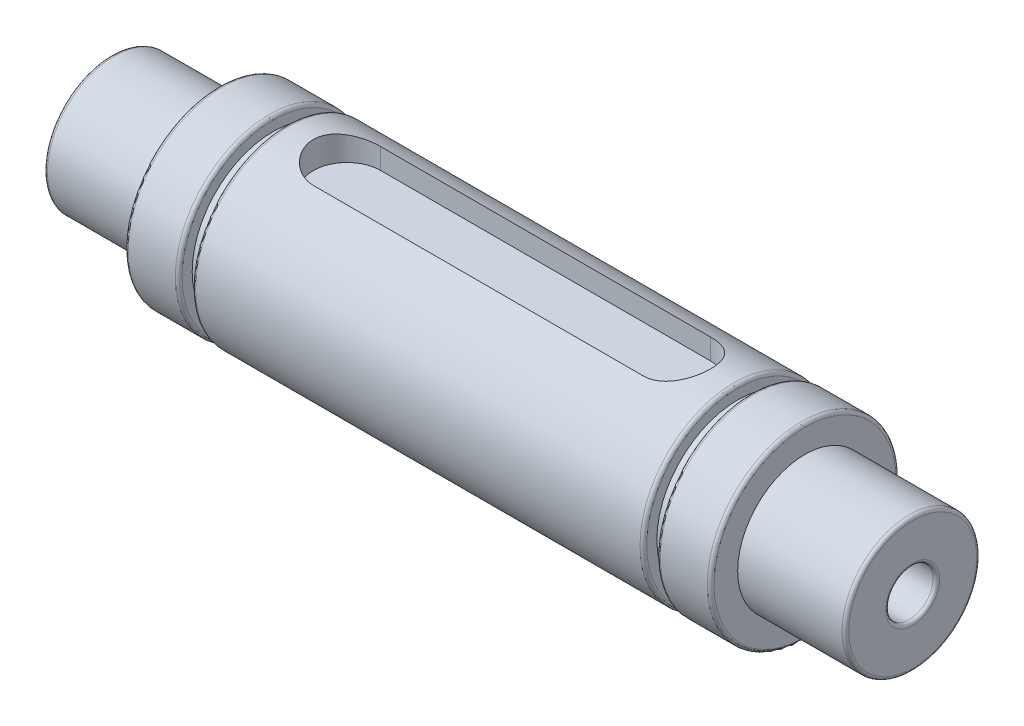
ISO-10303-21;
HEADER;
FILE_DESCRIPTION(('STEP AP214'),'2;1');
FILE_NAME('part.step','',(''),(''),'','','');
FILE_SCHEMA(('AUTOMOTIVE_DESIGN { 1 0 10303 214 1 1 1 1 }'));
ENDSEC;
DATA;
#1=APPLICATION_CONTEXT('core data for automotive mechanical design processes');
#2=APPLICATION_PROTOCOL_DEFINITION('international standard','automotive_design',2000,#1);
#3=PRODUCT_CONTEXT('',#1,'mechanical');
#4=PRODUCT('Part','Part','',(#3));
#5=PRODUCT_RELATED_PRODUCT_CATEGORY('part','',(#4));
#6=PRODUCT_DEFINITION_FORMATION('','',#4);
#7=PRODUCT_DEFINITION_CONTEXT('part definition',#1,'design');
#8=PRODUCT_DEFINITION('design','',#6,#7);
#9=PRODUCT_DEFINITION_SHAPE('','',#8);
#10=(LENGTH_UNIT() NAMED_UNIT(*) SI_UNIT(.MILLI.,.METRE.));
#11=(NAMED_UNIT(*) PLANE_ANGLE_UNIT() SI_UNIT($,.RADIAN.));
#12=(NAMED_UNIT(*) SI_UNIT($,.STERADIAN.) SOLID_ANGLE_UNIT());
#13=UNCERTAINTY_MEASURE_WITH_UNIT(LENGTH_MEASURE(1.E-05),#10,'distance_accuracy_value','');
#14=(GEOMETRIC_REPRESENTATION_CONTEXT(3) GLOBAL_UNCERTAINTY_ASSIGNED_CONTEXT((#13)) GLOBAL_UNIT_ASSIGNED_CONTEXT((#10,
#11,#12)) REPRESENTATION_CONTEXT('',''));
#15=CARTESIAN_POINT('',(0.,0.,0.));
#16=DIRECTION('',(0.,0.,1.));
#17=DIRECTION('',(1.,0.,0.));
#18=AXIS2_PLACEMENT_3D('',#15,#16,#17);
#19=CARTESIAN_POINT('',(-23.25,0.,-1.75));
#20=DIRECTION('',(1.,0.,0.));
#21=DIRECTION('',(0.,0.,-1.));
#22=AXIS2_PLACEMENT_3D('',#19,#20,#21);
#23=PLANE('',#22);
#24=CARTESIAN_POINT('',(-23.25,0.,0.));
#25=DIRECTION('',(1.,0.,0.));
#26=DIRECTION('',(0.,0.,-1.));
#27=AXIS2_PLACEMENT_3D('',#24,#25,#26);
#28=CIRCLE('',#27,0.25);
#29=CARTESIAN_POINT('',(-23.25,0.,-0.25));
#30=VERTEX_POINT('',#29);
#31=EDGE_CURVE('E181',#30,#30,#28,.F.);
#32=ORIENTED_EDGE('',*,*,#31,.T.);
#33=EDGE_LOOP('',(#32));
#34=FACE_BOUND('',#33,.T.);
#35=ADVANCED_FACE('F33',(#34),#23,.F.);
#36=CARTESIAN_POINT('',(23.25,0.,-1.75000000000001));
#37=DIRECTION('',(-1.,0.,0.));
#38=DIRECTION('',(0.,0.,1.));
#39=AXIS2_PLACEMENT_3D('',#36,#37,#38);
#40=PLANE('',#39);
#41=CARTESIAN_POINT('',(23.25,0.,0.));
#42=DIRECTION('',(-1.,0.,0.));
#43=DIRECTION('',(0.,0.,1.));
#44=AXIS2_PLACEMENT_3D('',#41,#42,#43);
#45=CIRCLE('',#44,0.250000000000008);
#46=CARTESIAN_POINT('',(23.25,0.,0.250000000000008));
#47=VERTEX_POINT('',#46);
#48=EDGE_CURVE('E190',#47,#47,#45,.F.);
#49=ORIENTED_EDGE('',*,*,#48,.T.);
#50=EDGE_LOOP('',(#49));
#51=FACE_BOUND('',#50,.T.);
#52=ADVANCED_FACE('F256',(#51),#40,.F.);
#53=CARTESIAN_POINT('',(-23.6016990362538,0.,0.));
#54=DIRECTION('',(-1.,0.,0.));
#55=DIRECTION('',(0.,0.,1.));
#56=AXIS2_PLACEMENT_3D('',#53,#54,#55);
#57=CYLINDRICAL_SURFACE('',#56,1.75000000000001);
#58=CARTESIAN_POINT('',(24.75,0.,0.));
#59=DIRECTION('',(-1.,0.,0.));
#60=DIRECTION('',(0.,0.,1.));
#61=AXIS2_PLACEMENT_3D('',#58,#59,#60);
#62=CIRCLE('',#61,1.75000000000001);
#63=CARTESIAN_POINT('',(24.75,0.,1.75000000000001));
#64=VERTEX_POINT('',#63);
#65=EDGE_CURVE('E187',#64,#64,#62,.T.);
#66=ORIENTED_EDGE('',*,*,#65,.T.);
#67=EDGE_LOOP('',(#66));
#68=FACE_BOUND('',#67,.T.);
#69=CARTESIAN_POINT('',(29.5,0.,0.));
#70=DIRECTION('',(-1.,0.,0.));
#71=DIRECTION('',(0.,0.,1.));
#72=AXIS2_PLACEMENT_3D('',#69,#70,#71);
#73=CIRCLE('',#72,1.75000000000001);
#74=CARTESIAN_POINT('',(29.5,0.,1.75000000000001));
#75=VERTEX_POINT('',#74);
#76=EDGE_CURVE('E127',#75,#75,#73,.F.);
#77=ORIENTED_EDGE('',*,*,#76,.T.);
#78=EDGE_LOOP('',(#77));
#79=FACE_BOUND('',#78,.T.);
#80=ADVANCED_FACE('F262',(#68,#79),#57,.F.);
#81=CARTESIAN_POINT('',(29.75,0.,-5.));
#82=DIRECTION('',(-1.,0.,0.));
#83=DIRECTION('',(0.,0.,1.));
#84=AXIS2_PLACEMENT_3D('',#81,#82,#83);
#85=PLANE('',#84);
#86=CARTESIAN_POINT('',(29.75,0.,0.));
#87=DIRECTION('',(-1.,0.,0.));
#88=DIRECTION('',(0.,0.,1.));
#89=AXIS2_PLACEMENT_3D('',#86,#87,#88);
#90=CIRCLE('',#89,2.00000000000001);
#91=CARTESIAN_POINT('',(29.75,0.,2.00000000000001));
#92=VERTEX_POINT('',#91);
#93=EDGE_CURVE('E124',#92,#92,#90,.T.);
#94=ORIENTED_EDGE('',*,*,#93,.T.);
#95=EDGE_LOOP('',(#94));
#96=FACE_BOUND('',#95,.T.);
#97=CARTESIAN_POINT('',(29.75,0.,0.));
#98=DIRECTION('',(-1.,0.,0.));
#99=DIRECTION('',(0.,0.,1.));
#100=AXIS2_PLACEMENT_3D('',#97,#98,#99);
#101=CIRCLE('',#100,4.75);
#102=CARTESIAN_POINT('',(29.75,0.,4.75));
#103=VERTEX_POINT('',#102);
#104=EDGE_CURVE('E121',#103,#103,#101,.F.);
#105=ORIENTED_EDGE('',*,*,#104,.T.);
#106=EDGE_LOOP('',(#105));
#107=FACE_BOUND('',#106,.T.);
#108=ADVANCED_FACE('F326',(#96,#107),#85,.F.);
#109=CARTESIAN_POINT('',(-23.6016990362538,0.,0.));
#110=DIRECTION('',(-1.,0.,0.));
#111=DIRECTION('',(0.,0.,1.));
#112=AXIS2_PLACEMENT_3D('',#109,#110,#111);
#113=CYLINDRICAL_SURFACE('',#112,5.);
#114=CARTESIAN_POINT('',(29.5,0.,0.));
#115=DIRECTION('',(-1.,0.,0.));
#116=DIRECTION('',(0.,0.,1.));
#117=AXIS2_PLACEMENT_3D('',#114,#115,#116);
#118=CIRCLE('',#117,5.);
#119=CARTESIAN_POINT('',(29.5,0.,5.));
#120=VERTEX_POINT('',#119);
#121=EDGE_CURVE('E178',#120,#120,#118,.T.);
#122=ORIENTED_EDGE('',*,*,#121,.T.);
#123=EDGE_LOOP('',(#122));
#124=FACE_BOUND('',#123,.T.);
#125=CARTESIAN_POINT('',(21.75,0.,0.));
#126=DIRECTION('',(-1.,0.,0.));
#127=DIRECTION('',(0.,0.,1.));
#128=AXIS2_PLACEMENT_3D('',#125,#126,#127);
#129=CIRCLE('',#128,5.);
#130=CARTESIAN_POINT('',(21.75,0.,5.));
#131=VERTEX_POINT('',#130);
#132=EDGE_CURVE('E118',#131,#131,#129,.T.);
#133=ORIENTED_EDGE('',*,*,#132,.F.);
#134=EDGE_LOOP('',(#133));
#135=FACE_BOUND('',#134,.T.);
#136=ADVANCED_FACE('F333',(#124,#135),#113,.T.);
#137=CARTESIAN_POINT('',(21.75,0.,-7.));
#138=DIRECTION('',(-1.,0.,0.));
#139=DIRECTION('',(0.,0.,1.));
#140=AXIS2_PLACEMENT_3D('',#137,#138,#139);
#141=PLANE('',#140);
#142=CARTESIAN_POINT('',(21.75,0.,0.));
#143=DIRECTION('',(-1.,0.,0.));
#144=DIRECTION('',(0.,0.,1.));
#145=AXIS2_PLACEMENT_3D('',#142,#143,#144);
#146=CIRCLE('',#145,6.75);
#147=CARTESIAN_POINT('',(21.75,0.,6.75));
#148=VERTEX_POINT('',#147);
#149=EDGE_CURVE('E175',#148,#148,#146,.F.);
#150=ORIENTED_EDGE('',*,*,#149,.T.);
#151=EDGE_LOOP('',(#150));
#152=FACE_BOUND('',#151,.T.);
#153=ORIENTED_EDGE('',*,*,#132,.T.);
#154=EDGE_LOOP('',(#153));
#155=FACE_BOUND('',#154,.T.);
#156=ADVANCED_FACE('F341',(#152,#155),#141,.F.);
#157=CARTESIAN_POINT('',(-23.6016990362538,0.,0.));
#158=DIRECTION('',(-1.,0.,0.));
#159=DIRECTION('',(0.,0.,1.));
#160=AXIS2_PLACEMENT_3D('',#157,#158,#159);
#161=CYLINDRICAL_SURFACE('',#160,7.);
#162=CARTESIAN_POINT('',(18.,0.,0.));
#163=DIRECTION('',(1.,0.,0.));
#164=DIRECTION('',(0.,0.,-1.));
#165=AXIS2_PLACEMENT_3D('',#162,#163,#164);
#166=CIRCLE('',#165,7.);
#167=CARTESIAN_POINT('',(18.,0.,-7.));
#168=VERTEX_POINT('',#167);
#169=EDGE_CURVE('E169',#168,#168,#166,.T.);
#170=ORIENTED_EDGE('',*,*,#169,.T.);
#171=EDGE_LOOP('',(#170));
#172=FACE_BOUND('',#171,.T.);
#173=CARTESIAN_POINT('',(21.5,0.,0.));
#174=DIRECTION('',(-1.,0.,0.));
#175=DIRECTION('',(0.,0.,1.));
#176=AXIS2_PLACEMENT_3D('',#173,#174,#175);
#177=CIRCLE('',#176,7.);
#178=CARTESIAN_POINT('',(21.5,0.,7.));
#179=VERTEX_POINT('',#178);
#180=EDGE_CURVE('E166',#179,#179,#177,.T.);
#181=ORIENTED_EDGE('',*,*,#180,.T.);
#182=EDGE_LOOP('',(#181));
#183=FACE_BOUND('',#182,.T.);
#184=ADVANCED_FACE('F346',(#172,#183),#161,.T.);
#185=CARTESIAN_POINT('',(17.75,0.,-6.00000000000001));
#186=DIRECTION('',(1.,0.,0.));
#187=DIRECTION('',(0.,0.,-1.));
#188=AXIS2_PLACEMENT_3D('',#185,#186,#187);
#189=PLANE('',#188);
#190=CARTESIAN_POINT('',(17.75,0.,0.));
#191=DIRECTION('',(1.,0.,0.));
#192=DIRECTION('',(0.,0.,-1.));
#193=AXIS2_PLACEMENT_3D('',#190,#191,#192);
#194=CIRCLE('',#193,6.75);
#195=CARTESIAN_POINT('',(17.75,0.,-6.75));
#196=VERTEX_POINT('',#195);
#197=EDGE_CURVE('E163',#196,#196,#194,.F.);
#198=ORIENTED_EDGE('',*,*,#197,.T.);
#199=EDGE_LOOP('',(#198));
#200=FACE_BOUND('',#199,.T.);
#201=CARTESIAN_POINT('',(17.75,0.,0.));
#202=DIRECTION('',(-1.,0.,0.));
#203=DIRECTION('',(0.,0.,1.));
#204=AXIS2_PLACEMENT_3D('',#201,#202,#203);
#205=CIRCLE('',#204,6.00000000000001);
#206=CARTESIAN_POINT('',(17.75,0.,6.00000000000001));
#207=VERTEX_POINT('',#206);
#208=EDGE_CURVE('E115',#207,#207,#205,.T.);
#209=ORIENTED_EDGE('',*,*,#208,.F.);
#210=EDGE_LOOP('',(#209));
#211=FACE_BOUND('',#210,.T.);
#212=ADVANCED_FACE('F352',(#200,#211),#189,.F.);
#213=CARTESIAN_POINT('',(-23.6016990362538,0.,0.));
#214=DIRECTION('',(-1.,0.,0.));
#215=DIRECTION('',(0.,0.,1.));
#216=AXIS2_PLACEMENT_3D('',#213,#214,#215);
#217=CYLINDRICAL_SURFACE('',#216,6.00000000000001);
#218=CARTESIAN_POINT('',(16.75,0.,0.));
#219=DIRECTION('',(-1.,0.,0.));
#220=DIRECTION('',(0.,0.,1.));
#221=AXIS2_PLACEMENT_3D('',#218,#219,#220);
#222=CIRCLE('',#221,6.);
#223=CARTESIAN_POINT('',(16.75,0.,6.));
#224=VERTEX_POINT('',#223);
#225=EDGE_CURVE('E112',#224,#224,#222,.T.);
#226=ORIENTED_EDGE('',*,*,#225,.F.);
#227=EDGE_LOOP('',(#226));
#228=FACE_BOUND('',#227,.T.);
#229=ORIENTED_EDGE('',*,*,#208,.T.);
#230=EDGE_LOOP('',(#229));
#231=FACE_BOUND('',#230,.T.);
#232=ADVANCED_FACE('F358',(#228,#231),#217,.T.);
#233=CARTESIAN_POINT('',(16.75,0.,-7.));
#234=DIRECTION('',(-1.,0.,0.));
#235=DIRECTION('',(0.,0.,1.));
#236=AXIS2_PLACEMENT_3D('',#233,#234,#235);
#237=PLANE('',#236);
#238=CARTESIAN_POINT('',(16.75,0.,0.));
#239=DIRECTION('',(-1.,0.,0.));
#240=DIRECTION('',(0.,0.,1.));
#241=AXIS2_PLACEMENT_3D('',#238,#239,#240);
#242=CIRCLE('',#241,6.75);
#243=CARTESIAN_POINT('',(16.75,0.,6.75));
#244=VERTEX_POINT('',#243);
#245=EDGE_CURVE('E172',#244,#244,#242,.F.);
#246=ORIENTED_EDGE('',*,*,#245,.T.);
#247=EDGE_LOOP('',(#246));
#248=FACE_BOUND('',#247,.T.);
#249=ORIENTED_EDGE('',*,*,#225,.T.);
#250=EDGE_LOOP('',(#249));
#251=FACE_BOUND('',#250,.T.);
#252=ADVANCED_FACE('F252',(#248,#251),#237,.F.);
#253=CARTESIAN_POINT('',(-23.6016990362538,0.,0.));
#254=DIRECTION('',(-1.,0.,0.));
#255=DIRECTION('',(0.,0.,1.));
#256=AXIS2_PLACEMENT_3D('',#253,#254,#255);
#257=CYLINDRICAL_SURFACE('',#256,7.);
#258=DIRECTION('',(-1.,0.,0.));
#259=VECTOR('',#258,1.);
#260=CARTESIAN_POINT('',(-23.6016990362538,6.53834841531101,-2.5));
#261=LINE('',#260,#259);
#262=CARTESIAN_POINT('',(-12.25,6.53834841531101,-2.5));
#263=VERTEX_POINT('',#262);
#264=CARTESIAN_POINT('',(12.25,6.53834841531101,-2.5));
#265=VERTEX_POINT('',#264);
#266=EDGE_CURVE('E11',#263,#265,#261,.F.);
#267=ORIENTED_EDGE('',*,*,#266,.T.);
#268=CARTESIAN_POINT('',(12.25,6.53834841531101,-2.5));
#269=CARTESIAN_POINT('',(12.3178892457289,6.53833653785132,-2.50000932220903));
#270=CARTESIAN_POINT('',(12.3857719326391,6.53940549922738,-2.49723485076694));
#271=CARTESIAN_POINT('',(12.5210039106114,6.54361657478133,-2.4861910211816));
#272=CARTESIAN_POINT('',(12.5883533586061,6.54675805418062,-2.47792334551208));
#273=CARTESIAN_POINT('',(12.7218214146028,6.55501217637942,-2.45600175285899));
#274=CARTESIAN_POINT('',(12.7879433363398,6.56011831705676,-2.44236559963955));
#275=CARTESIAN_POINT('',(12.9187018351085,6.57213177854175,-2.40985115466648));
#276=CARTESIAN_POINT('',(12.9833383463124,6.57903917900746,-2.39097263107435));
#277=CARTESIAN_POINT('',(13.1742643664775,6.60214934365709,-2.32673964179204));
#278=CARTESIAN_POINT('',(13.2977904521356,6.62075475340844,-2.27375112606986));
#279=CARTESIAN_POINT('',(13.534230333128,6.6622539736071,-2.14910757865425));
#280=CARTESIAN_POINT('',(13.6471363167355,6.68515090424875,-2.07743895048849));
#281=CARTESIAN_POINT('',(13.8642152133527,6.73379913792223,-1.91402571101969));
#282=CARTESIAN_POINT('',(13.9678464751959,6.75962864041371,-1.82158337146744));
#283=CARTESIAN_POINT('',(14.1585087047164,6.8105759232303,-1.6207338877633));
#284=CARTESIAN_POINT('',(14.2455365792434,6.83569357019867,-1.51232377552673));
#285=CARTESIAN_POINT('',(14.403089855455,6.88331133279046,-1.27853915335934));
#286=CARTESIAN_POINT('',(14.4730315218605,6.90570835223796,-1.15274833789185));
#287=CARTESIAN_POINT('',(14.5905366467974,6.94442357672633,-0.890250825476633));
#288=CARTESIAN_POINT('',(14.638107779046,6.96074386585465,-0.753547890540325));
#289=CARTESIAN_POINT('',(14.7076406021824,6.9849105051071,-0.478829979256173));
#290=CARTESIAN_POINT('',(14.7305391304711,6.99306594352514,-0.341079835227465));
#291=CARTESIAN_POINT('',(14.7530684027776,7.00108798053822,-0.0634643052969026));
#292=CARTESIAN_POINT('',(14.7527055860346,7.00095687302702,0.0764004845074493));
#293=CARTESIAN_POINT('',(14.7292887262389,6.99262258049077,0.347593258486946));
#294=CARTESIAN_POINT('',(14.7072552058015,6.98478243583516,0.479022407078721));
#295=CARTESIAN_POINT('',(14.6428265758412,6.96237832507347,0.736175812143608));
#296=CARTESIAN_POINT('',(14.6004303156375,6.94781397899037,0.861899745780464));
#297=CARTESIAN_POINT('',(14.4959530884347,6.91316506890368,1.10616102429807));
#298=CARTESIAN_POINT('',(14.4336042850399,6.89300592164314,1.22457279066906));
#299=CARTESIAN_POINT('',(14.2912206647766,6.8492335561632,1.44953531305523));
#300=CARTESIAN_POINT('',(14.2111804762164,6.82561928959263,1.5560824517677));
#301=CARTESIAN_POINT('',(14.0306767363433,6.77590547805489,1.7603244525607));
#302=CARTESIAN_POINT('',(13.9293502768551,6.74974055843875,1.85724185700418));
#303=CARTESIAN_POINT('',(13.7116726358344,6.69890342468975,2.03299914621296));
#304=CARTESIAN_POINT('',(13.5953160948315,6.67423174765256,2.11183255456462));
#305=CARTESIAN_POINT('',(13.348057401478,6.62877803875404,2.25049860898459));
#306=CARTESIAN_POINT('',(13.2169210244946,6.60807875118994,2.30994207989625));
#307=CARTESIAN_POINT('',(12.9456351984178,6.57388213610267,2.4055543972585));
#308=CARTESIAN_POINT('',(12.805500858831,6.56037307165053,2.44176119399954));
#309=CARTESIAN_POINT('',(12.5949694557358,6.54708542245562,2.47705497148627));
#310=CARTESIAN_POINT('',(12.5262636982282,6.54382010967907,2.48565347586445));
#311=CARTESIAN_POINT('',(12.3883848358083,6.53944910829676,2.49712352174882));
#312=CARTESIAN_POINT('',(12.3192123328995,6.53834103140935,2.50000139665367));
#313=CARTESIAN_POINT('',(12.25,6.53834841531101,2.5));
#314=B_SPLINE_CURVE_WITH_KNOTS('',3,(#268,#269,#270,#271,#272,#273,#274,#275,#276,#277,#278,
#279,#280,#281,#282,#283,#284,#285,#286,#287,#288,#289,#290,#291,#292,#293,#294,#295,#296,#297,
#298,#299,#300,#301,#302,#303,#304,#305,#306,#307,#308,#309,#310,#311,#312,#313),.UNSPECIFIED.,
.F.,.F.,(4,2,2,2,2,2,2,2,2,2,2,2,2,2,2,2,2,2,2,2,2,2,4),(0.,0.203591628551591,0.407120929225528,
0.609982356545741,0.812852756635989,1.21793118555512,1.6233052814847,2.0451597231193,
2.4670926781184,2.90188398965561,3.33652604665238,3.75400993940861,4.17137826416922,
4.56998920861347,4.96862268086887,5.37284909448639,5.77719841367921,6.20315837945088,
6.62927065674721,7.06347329058505,7.49696496492444,7.70468580162772,7.91217653896403),.UNSPECIFIED.);
#315=CARTESIAN_POINT('',(12.25,6.53834841531101,2.5));
#316=VERTEX_POINT('',#315);
#317=EDGE_CURVE('E193',#265,#316,#314,.T.);
#318=ORIENTED_EDGE('',*,*,#317,.T.);
#319=DIRECTION('',(-1.,0.,0.));
#320=VECTOR('',#319,1.);
#321=CARTESIAN_POINT('',(-23.6016990362538,6.53834841531101,2.5));
#322=LINE('',#321,#320);
#323=CARTESIAN_POINT('',(-12.25,6.53834841531101,2.5));
#324=VERTEX_POINT('',#323);
#325=EDGE_CURVE('E41',#316,#324,#322,.T.);
#326=ORIENTED_EDGE('',*,*,#325,.T.);
#327=CARTESIAN_POINT('',(-12.25,6.53834841531101,2.5));
#328=CARTESIAN_POINT('',(-12.3178892457289,6.53833653785132,2.50000932220903));
#329=CARTESIAN_POINT('',(-12.3857719326391,6.53940549922738,2.49723485076694));
#330=CARTESIAN_POINT('',(-12.5210039106114,6.54361657478133,2.4861910211816));
#331=CARTESIAN_POINT('',(-12.5883533586061,6.54675805418062,2.47792334551208));
#332=CARTESIAN_POINT('',(-12.7218214146028,6.55501217637942,2.456001752859));
#333=CARTESIAN_POINT('',(-12.7879433363398,6.56011831705676,2.44236559963955));
#334=CARTESIAN_POINT('',(-12.9187018351085,6.57213177854175,2.40985115466648));
#335=CARTESIAN_POINT('',(-12.9833383463124,6.57903917900746,2.39097263107435));
#336=CARTESIAN_POINT('',(-13.1742643664775,6.60214934365709,2.32673964179204));
#337=CARTESIAN_POINT('',(-13.2977904521356,6.62075475340844,2.27375112606986));
#338=CARTESIAN_POINT('',(-13.534230333128,6.6622539736071,2.14910757865425));
#339=CARTESIAN_POINT('',(-13.6471363167355,6.68515090424875,2.07743895048849));
#340=CARTESIAN_POINT('',(-13.8642152133527,6.73379913792223,1.9140257110197));
#341=CARTESIAN_POINT('',(-13.9678464751959,6.75962864041371,1.82158337146744));
#342=CARTESIAN_POINT('',(-14.1585087047164,6.8105759232303,1.6207338877633));
#343=CARTESIAN_POINT('',(-14.2455365792434,6.83569357019867,1.51232377552673));
#344=CARTESIAN_POINT('',(-14.403089855455,6.88331133279046,1.27853915335934));
#345=CARTESIAN_POINT('',(-14.4730315218605,6.90570835223796,1.15274833789185));
#346=CARTESIAN_POINT('',(-14.5905366467974,6.94442357672633,0.890250825476635));
#347=CARTESIAN_POINT('',(-14.638107779046,6.96074386585465,0.753547890540327));
#348=CARTESIAN_POINT('',(-14.7076406021824,6.9849105051071,0.478829979256174));
#349=CARTESIAN_POINT('',(-14.7305391304711,6.99306594352514,0.341079835227466));
#350=CARTESIAN_POINT('',(-14.7530684027776,7.00108798053822,0.063464305296903));
#351=CARTESIAN_POINT('',(-14.7527055860346,7.00095687302702,-0.0764004845074488));
#352=CARTESIAN_POINT('',(-14.7292887262389,6.99262258049077,-0.347593258486946));
#353=CARTESIAN_POINT('',(-14.7072552058015,6.98478243583516,-0.479022407078721));
#354=CARTESIAN_POINT('',(-14.6428265758412,6.96237832507347,-0.736175812143609));
#355=CARTESIAN_POINT('',(-14.6004303156375,6.94781397899037,-0.861899745780465));
#356=CARTESIAN_POINT('',(-14.4959530884347,6.91316506890368,-1.10616102429807));
#357=CARTESIAN_POINT('',(-14.4336042850399,6.89300592164314,-1.22457279066906));
#358=CARTESIAN_POINT('',(-14.2912206647766,6.8492335561632,-1.44953531305523));
#359=CARTESIAN_POINT('',(-14.2111804762164,6.82561928959263,-1.55608245176771));
#360=CARTESIAN_POINT('',(-14.0306767363433,6.77590547805489,-1.7603244525607));
#361=CARTESIAN_POINT('',(-13.9293502768551,6.74974055843875,-1.85724185700418));
#362=CARTESIAN_POINT('',(-13.7116726358344,6.69890342468975,-2.03299914621296));
#363=CARTESIAN_POINT('',(-13.5953160948315,6.67423174765256,-2.11183255456462));
#364=CARTESIAN_POINT('',(-13.348057401478,6.62877803875404,-2.25049860898459));
#365=CARTESIAN_POINT('',(-13.2169210244946,6.60807875118994,-2.30994207989626));
#366=CARTESIAN_POINT('',(-12.9456351984178,6.57388213610267,-2.4055543972585));
#367=CARTESIAN_POINT('',(-12.805500858831,6.56037307165053,-2.44176119399954));
#368=CARTESIAN_POINT('',(-12.5949694557358,6.54708542245562,-2.47705497148627));
#369=CARTESIAN_POINT('',(-12.5262636982282,6.54382010967907,-2.48565347586445));
#370=CARTESIAN_POINT('',(-12.3883848358083,6.53944910829676,-2.49712352174882));
#371=CARTESIAN_POINT('',(-12.3192123328995,6.53834103140935,-2.50000139665367));
#372=CARTESIAN_POINT('',(-12.25,6.53834841531101,-2.5));
#373=B_SPLINE_CURVE_WITH_KNOTS('',3,(#327,#328,#329,#330,#331,#332,#333,#334,#335,#336,#337,
#338,#339,#340,#341,#342,#343,#344,#345,#346,#347,#348,#349,#350,#351,#352,#353,#354,#355,#356,
#357,#358,#359,#360,#361,#362,#363,#364,#365,#366,#367,#368,#369,#370,#371,#372),.UNSPECIFIED.,
.F.,.F.,(4,2,2,2,2,2,2,2,2,2,2,2,2,2,2,2,2,2,2,2,2,2,4),(0.,0.203591628551591,0.40712092922553,
0.609982356545741,0.812852756635989,1.21793118555512,1.6233052814847,2.0451597231193,
2.4670926781184,2.90188398965561,3.33652604665238,3.75400993940861,4.17137826416922,
4.56998920861347,4.96862268086888,5.37284909448639,5.77719841367922,6.20315837945088,
6.62927065674721,7.06347329058505,7.49696496492444,7.70468580162773,7.91217653896403),.UNSPECIFIED.);
#374=EDGE_CURVE('E56',#324,#263,#373,.T.);
#375=ORIENTED_EDGE('',*,*,#374,.T.);
#376=EDGE_LOOP('',(#267,#318,#326,#375));
#377=FACE_BOUND('',#376,.T.);
#378=CARTESIAN_POINT('',(-16.5,0.,0.));
#379=DIRECTION('',(1.,0.,0.));
#380=DIRECTION('',(0.,0.,-1.));
#381=AXIS2_PLACEMENT_3D('',#378,#379,#380);
#382=CIRCLE('',#381,7.);
#383=CARTESIAN_POINT('',(-16.5,0.,-7.));
#384=VERTEX_POINT('',#383);
#385=EDGE_CURVE('E157',#384,#384,#382,.T.);
#386=ORIENTED_EDGE('',*,*,#385,.T.);
#387=EDGE_LOOP('',(#386));
#388=FACE_BOUND('',#387,.T.);
#389=CARTESIAN_POINT('',(16.5,0.,0.));
#390=DIRECTION('',(-1.,0.,0.));
#391=DIRECTION('',(0.,0.,1.));
#392=AXIS2_PLACEMENT_3D('',#389,#390,#391);
#393=CIRCLE('',#392,7.);
#394=CARTESIAN_POINT('',(16.5,0.,7.));
#395=VERTEX_POINT('',#394);
#396=EDGE_CURVE('E154',#395,#395,#393,.T.);
#397=ORIENTED_EDGE('',*,*,#396,.T.);
#398=EDGE_LOOP('',(#397));
#399=FACE_BOUND('',#398,.T.);
#400=ADVANCED_FACE('F206',(#377,#388,#399),#257,.T.);
#401=CARTESIAN_POINT('',(-16.75,0.,-6.));
#402=DIRECTION('',(1.,0.,0.));
#403=DIRECTION('',(0.,0.,-1.));
#404=AXIS2_PLACEMENT_3D('',#401,#402,#403);
#405=PLANE('',#404);
#406=CARTESIAN_POINT('',(-16.75,0.,0.));
#407=DIRECTION('',(1.,0.,0.));
#408=DIRECTION('',(0.,0.,-1.));
#409=AXIS2_PLACEMENT_3D('',#406,#407,#408);
#410=CIRCLE('',#409,6.75);
#411=CARTESIAN_POINT('',(-16.75,0.,-6.75));
#412=VERTEX_POINT('',#411);
#413=EDGE_CURVE('E151',#412,#412,#410,.F.);
#414=ORIENTED_EDGE('',*,*,#413,.T.);
#415=EDGE_LOOP('',(#414));
#416=FACE_BOUND('',#415,.T.);
#417=CARTESIAN_POINT('',(-16.75,0.,0.));
#418=DIRECTION('',(-1.,0.,0.));
#419=DIRECTION('',(0.,0.,1.));
#420=AXIS2_PLACEMENT_3D('',#417,#418,#419);
#421=CIRCLE('',#420,6.);
#422=CARTESIAN_POINT('',(-16.75,0.,6.));
#423=VERTEX_POINT('',#422);
#424=EDGE_CURVE('E109',#423,#423,#421,.T.);
#425=ORIENTED_EDGE('',*,*,#424,.F.);
#426=EDGE_LOOP('',(#425));
#427=FACE_BOUND('',#426,.T.);
#428=ADVANCED_FACE('F245',(#416,#427),#405,.F.);
#429=CARTESIAN_POINT('',(-23.6016990362538,0.,0.));
#430=DIRECTION('',(-1.,0.,0.));
#431=DIRECTION('',(0.,0.,1.));
#432=AXIS2_PLACEMENT_3D('',#429,#430,#431);
#433=CYLINDRICAL_SURFACE('',#432,6.);
#434=CARTESIAN_POINT('',(-17.75,0.,0.));
#435=DIRECTION('',(-1.,0.,0.));
#436=DIRECTION('',(0.,0.,1.));
#437=AXIS2_PLACEMENT_3D('',#434,#435,#436);
#438=CIRCLE('',#437,6.);
#439=CARTESIAN_POINT('',(-17.75,0.,6.));
#440=VERTEX_POINT('',#439);
#441=EDGE_CURVE('E106',#440,#440,#438,.T.);
#442=ORIENTED_EDGE('',*,*,#441,.F.);
#443=EDGE_LOOP('',(#442));
#444=FACE_BOUND('',#443,.T.);
#445=ORIENTED_EDGE('',*,*,#424,.T.);
#446=EDGE_LOOP('',(#445));
#447=FACE_BOUND('',#446,.T.);
#448=ADVANCED_FACE('F242',(#444,#447),#433,.T.);
#449=CARTESIAN_POINT('',(-17.75,0.,-7.));
#450=DIRECTION('',(-1.,0.,0.));
#451=DIRECTION('',(0.,0.,1.));
#452=AXIS2_PLACEMENT_3D('',#449,#450,#451);
#453=PLANE('',#452);
#454=CARTESIAN_POINT('',(-17.75,0.,0.));
#455=DIRECTION('',(-1.,0.,0.));
#456=DIRECTION('',(0.,0.,1.));
#457=AXIS2_PLACEMENT_3D('',#454,#455,#456);
#458=CIRCLE('',#457,6.75);
#459=CARTESIAN_POINT('',(-17.75,0.,6.75));
#460=VERTEX_POINT('',#459);
#461=EDGE_CURVE('E160',#460,#460,#458,.F.);
#462=ORIENTED_EDGE('',*,*,#461,.T.);
#463=EDGE_LOOP('',(#462));
#464=FACE_BOUND('',#463,.T.);
#465=ORIENTED_EDGE('',*,*,#441,.T.);
#466=EDGE_LOOP('',(#465));
#467=FACE_BOUND('',#466,.T.);
#468=ADVANCED_FACE('F238',(#464,#467),#453,.F.);
#469=CARTESIAN_POINT('',(-23.6016990362538,0.,0.));
#470=DIRECTION('',(-1.,0.,0.));
#471=DIRECTION('',(0.,0.,1.));
#472=AXIS2_PLACEMENT_3D('',#469,#470,#471);
#473=CYLINDRICAL_SURFACE('',#472,7.);
#474=CARTESIAN_POINT('',(-21.5,0.,0.));
#475=DIRECTION('',(1.,0.,0.));
#476=DIRECTION('',(0.,0.,-1.));
#477=AXIS2_PLACEMENT_3D('',#474,#475,#476);
#478=CIRCLE('',#477,7.);
#479=CARTESIAN_POINT('',(-21.5,0.,-7.));
#480=VERTEX_POINT('',#479);
#481=EDGE_CURVE('E148',#480,#480,#478,.T.);
#482=ORIENTED_EDGE('',*,*,#481,.T.);
#483=EDGE_LOOP('',(#482));
#484=FACE_BOUND('',#483,.T.);
#485=CARTESIAN_POINT('',(-18.,0.,0.));
#486=DIRECTION('',(-1.,0.,0.));
#487=DIRECTION('',(0.,0.,1.));
#488=AXIS2_PLACEMENT_3D('',#485,#486,#487);
#489=CIRCLE('',#488,7.);
#490=CARTESIAN_POINT('',(-18.,0.,7.));
#491=VERTEX_POINT('',#490);
#492=EDGE_CURVE('E145',#491,#491,#489,.T.);
#493=ORIENTED_EDGE('',*,*,#492,.T.);
#494=EDGE_LOOP('',(#493));
#495=FACE_BOUND('',#494,.T.);
#496=ADVANCED_FACE('F234',(#484,#495),#473,.T.);
#497=CARTESIAN_POINT('',(-21.75,0.,-5.));
#498=DIRECTION('',(1.,0.,0.));
#499=DIRECTION('',(0.,0.,-1.));
#500=AXIS2_PLACEMENT_3D('',#497,#498,#499);
#501=PLANE('',#500);
#502=CARTESIAN_POINT('',(-21.75,0.,0.));
#503=DIRECTION('',(1.,0.,0.));
#504=DIRECTION('',(0.,0.,-1.));
#505=AXIS2_PLACEMENT_3D('',#502,#503,#504);
#506=CIRCLE('',#505,6.75);
#507=CARTESIAN_POINT('',(-21.75,0.,-6.75));
#508=VERTEX_POINT('',#507);
#509=EDGE_CURVE('E142',#508,#508,#506,.F.);
#510=ORIENTED_EDGE('',*,*,#509,.T.);
#511=EDGE_LOOP('',(#510));
#512=FACE_BOUND('',#511,.T.);
#513=CARTESIAN_POINT('',(-21.75,0.,0.));
#514=DIRECTION('',(-1.,0.,0.));
#515=DIRECTION('',(0.,0.,1.));
#516=AXIS2_PLACEMENT_3D('',#513,#514,#515);
#517=CIRCLE('',#516,5.);
#518=CARTESIAN_POINT('',(-21.75,0.,5.));
#519=VERTEX_POINT('',#518);
#520=EDGE_CURVE('E100',#519,#519,#517,.T.);
#521=ORIENTED_EDGE('',*,*,#520,.F.);
#522=EDGE_LOOP('',(#521));
#523=FACE_BOUND('',#522,.T.);
#524=ADVANCED_FACE('F230',(#512,#523),#501,.F.);
#525=CARTESIAN_POINT('',(-23.6016990362538,0.,0.));
#526=DIRECTION('',(-1.,0.,0.));
#527=DIRECTION('',(0.,0.,1.));
#528=AXIS2_PLACEMENT_3D('',#525,#526,#527);
#529=CYLINDRICAL_SURFACE('',#528,5.);
#530=CARTESIAN_POINT('',(-29.5,0.,0.));
#531=DIRECTION('',(1.,0.,0.));
#532=DIRECTION('',(0.,0.,-1.));
#533=AXIS2_PLACEMENT_3D('',#530,#531,#532);
#534=CIRCLE('',#533,5.);
#535=CARTESIAN_POINT('',(-29.5,0.,-5.));
#536=VERTEX_POINT('',#535);
#537=EDGE_CURVE('E139',#536,#536,#534,.T.);
#538=ORIENTED_EDGE('',*,*,#537,.T.);
#539=EDGE_LOOP('',(#538));
#540=FACE_BOUND('',#539,.T.);
#541=ORIENTED_EDGE('',*,*,#520,.T.);
#542=EDGE_LOOP('',(#541));
#543=FACE_BOUND('',#542,.T.);
#544=ADVANCED_FACE('F226',(#540,#543),#529,.T.);
#545=CARTESIAN_POINT('',(-29.75,0.,-5.));
#546=DIRECTION('',(1.,0.,0.));
#547=DIRECTION('',(0.,0.,-1.));
#548=AXIS2_PLACEMENT_3D('',#545,#546,#547);
#549=PLANE('',#548);
#550=CARTESIAN_POINT('',(-29.75,0.,0.));
#551=DIRECTION('',(1.,0.,0.));
#552=DIRECTION('',(0.,0.,-1.));
#553=AXIS2_PLACEMENT_3D('',#550,#551,#552);
#554=CIRCLE('',#553,2.);
#555=CARTESIAN_POINT('',(-29.75,0.,-2.));
#556=VERTEX_POINT('',#555);
#557=EDGE_CURVE('E136',#556,#556,#554,.T.);
#558=ORIENTED_EDGE('',*,*,#557,.T.);
#559=EDGE_LOOP('',(#558));
#560=FACE_BOUND('',#559,.T.);
#561=CARTESIAN_POINT('',(-29.75,0.,0.));
#562=DIRECTION('',(1.,0.,0.));
#563=DIRECTION('',(0.,0.,-1.));
#564=AXIS2_PLACEMENT_3D('',#561,#562,#563);
#565=CIRCLE('',#564,4.75);
#566=CARTESIAN_POINT('',(-29.75,0.,-4.75));
#567=VERTEX_POINT('',#566);
#568=EDGE_CURVE('E133',#567,#567,#565,.F.);
#569=ORIENTED_EDGE('',*,*,#568,.T.);
#570=EDGE_LOOP('',(#569));
#571=FACE_BOUND('',#570,.T.);
#572=ADVANCED_FACE('F222',(#560,#571),#549,.F.);
#573=CARTESIAN_POINT('',(-23.6016990362538,0.,0.));
#574=DIRECTION('',(-1.,0.,0.));
#575=DIRECTION('',(0.,0.,1.));
#576=AXIS2_PLACEMENT_3D('',#573,#574,#575);
#577=CYLINDRICAL_SURFACE('',#576,1.75);
#578=CARTESIAN_POINT('',(-24.75,0.,0.));
#579=DIRECTION('',(1.,0.,0.));
#580=DIRECTION('',(0.,0.,-1.));
#581=AXIS2_PLACEMENT_3D('',#578,#579,#580);
#582=CIRCLE('',#581,1.75);
#583=CARTESIAN_POINT('',(-24.75,0.,-1.75));
#584=VERTEX_POINT('',#583);
#585=EDGE_CURVE('E184',#584,#584,#582,.T.);
#586=ORIENTED_EDGE('',*,*,#585,.T.);
#587=EDGE_LOOP('',(#586));
#588=FACE_BOUND('',#587,.T.);
#589=CARTESIAN_POINT('',(-29.5,0.,0.));
#590=DIRECTION('',(1.,0.,0.));
#591=DIRECTION('',(0.,0.,-1.));
#592=AXIS2_PLACEMENT_3D('',#589,#590,#591);
#593=CIRCLE('',#592,1.75);
#594=CARTESIAN_POINT('',(-29.5,0.,-1.75));
#595=VERTEX_POINT('',#594);
#596=EDGE_CURVE('E130',#595,#595,#593,.F.);
#597=ORIENTED_EDGE('',*,*,#596,.T.);
#598=EDGE_LOOP('',(#597));
#599=FACE_BOUND('',#598,.T.);
#600=ADVANCED_FACE('F218',(#588,#599),#577,.F.);
#601=CARTESIAN_POINT('',(29.5,0.,0.));
#602=DIRECTION('',(-1.,0.,0.));
#603=DIRECTION('',(0.,0.,1.));
#604=AXIS2_PLACEMENT_3D('',#601,#602,#603);
#605=TOROIDAL_SURFACE('',#604,2.00000000000001,0.25);
#606=ORIENTED_EDGE('',*,*,#76,.F.);
#607=EDGE_LOOP('',(#606));
#608=FACE_BOUND('',#607,.T.);
#609=ORIENTED_EDGE('',*,*,#93,.F.);
#610=EDGE_LOOP('',(#609));
#611=FACE_BOUND('',#610,.T.);
#612=ADVANCED_FACE('F221',(#608,#611),#605,.T.);
#613=CARTESIAN_POINT('',(-29.5,0.,0.));
#614=DIRECTION('',(1.,0.,0.));
#615=DIRECTION('',(0.,0.,-1.));
#616=AXIS2_PLACEMENT_3D('',#613,#614,#615);
#617=TOROIDAL_SURFACE('',#616,2.,0.25);
#618=ORIENTED_EDGE('',*,*,#557,.F.);
#619=EDGE_LOOP('',(#618));
#620=FACE_BOUND('',#619,.T.);
#621=ORIENTED_EDGE('',*,*,#596,.F.);
#622=EDGE_LOOP('',(#621));
#623=FACE_BOUND('',#622,.T.);
#624=ADVANCED_FACE('F269',(#620,#623),#617,.T.);
#625=CARTESIAN_POINT('',(-29.5,0.,0.));
#626=DIRECTION('',(1.,0.,0.));
#627=DIRECTION('',(0.,0.,-1.));
#628=AXIS2_PLACEMENT_3D('',#625,#626,#627);
#629=TOROIDAL_SURFACE('',#628,4.75,0.25);
#630=ORIENTED_EDGE('',*,*,#537,.F.);
#631=EDGE_LOOP('',(#630));
#632=FACE_BOUND('',#631,.T.);
#633=ORIENTED_EDGE('',*,*,#568,.F.);
#634=EDGE_LOOP('',(#633));
#635=FACE_BOUND('',#634,.T.);
#636=ADVANCED_FACE('F273',(#632,#635),#629,.T.);
#637=CARTESIAN_POINT('',(-21.5,0.,0.));
#638=DIRECTION('',(1.,0.,0.));
#639=DIRECTION('',(0.,0.,-1.));
#640=AXIS2_PLACEMENT_3D('',#637,#638,#639);
#641=TOROIDAL_SURFACE('',#640,6.75,0.25);
#642=ORIENTED_EDGE('',*,*,#481,.F.);
#643=EDGE_LOOP('',(#642));
#644=FACE_BOUND('',#643,.T.);
#645=ORIENTED_EDGE('',*,*,#509,.F.);
#646=EDGE_LOOP('',(#645));
#647=FACE_BOUND('',#646,.T.);
#648=ADVANCED_FACE('F277',(#644,#647),#641,.T.);
#649=CARTESIAN_POINT('',(-16.5,0.,0.));
#650=DIRECTION('',(1.,0.,0.));
#651=DIRECTION('',(0.,0.,-1.));
#652=AXIS2_PLACEMENT_3D('',#649,#650,#651);
#653=TOROIDAL_SURFACE('',#652,6.75,0.25);
#654=ORIENTED_EDGE('',*,*,#385,.F.);
#655=EDGE_LOOP('',(#654));
#656=FACE_BOUND('',#655,.T.);
#657=ORIENTED_EDGE('',*,*,#413,.F.);
#658=EDGE_LOOP('',(#657));
#659=FACE_BOUND('',#658,.T.);
#660=ADVANCED_FACE('F281',(#656,#659),#653,.T.);
#661=CARTESIAN_POINT('',(-18.,0.,0.));
#662=DIRECTION('',(-1.,0.,0.));
#663=DIRECTION('',(0.,0.,1.));
#664=AXIS2_PLACEMENT_3D('',#661,#662,#663);
#665=TOROIDAL_SURFACE('',#664,6.75,0.25);
#666=ORIENTED_EDGE('',*,*,#461,.F.);
#667=EDGE_LOOP('',(#666));
#668=FACE_BOUND('',#667,.T.);
#669=ORIENTED_EDGE('',*,*,#492,.F.);
#670=EDGE_LOOP('',(#669));
#671=FACE_BOUND('',#670,.T.);
#672=ADVANCED_FACE('F285',(#668,#671),#665,.T.);
#673=CARTESIAN_POINT('',(18.,0.,0.));
#674=DIRECTION('',(1.,0.,0.));
#675=DIRECTION('',(0.,0.,-1.));
#676=AXIS2_PLACEMENT_3D('',#673,#674,#675);
#677=TOROIDAL_SURFACE('',#676,6.75,0.25);
#678=ORIENTED_EDGE('',*,*,#169,.F.);
#679=EDGE_LOOP('',(#678));
#680=FACE_BOUND('',#679,.T.);
#681=ORIENTED_EDGE('',*,*,#197,.F.);
#682=EDGE_LOOP('',(#681));
#683=FACE_BOUND('',#682,.T.);
#684=ADVANCED_FACE('F289',(#680,#683),#677,.T.);
#685=CARTESIAN_POINT('',(16.5,0.,0.));
#686=DIRECTION('',(-1.,0.,0.));
#687=DIRECTION('',(0.,0.,1.));
#688=AXIS2_PLACEMENT_3D('',#685,#686,#687);
#689=TOROIDAL_SURFACE('',#688,6.75,0.25);
#690=ORIENTED_EDGE('',*,*,#245,.F.);
#691=EDGE_LOOP('',(#690));
#692=FACE_BOUND('',#691,.T.);
#693=ORIENTED_EDGE('',*,*,#396,.F.);
#694=EDGE_LOOP('',(#693));
#695=FACE_BOUND('',#694,.T.);
#696=ADVANCED_FACE('F293',(#692,#695),#689,.T.);
#697=CARTESIAN_POINT('',(21.5,0.,0.));
#698=DIRECTION('',(-1.,0.,0.));
#699=DIRECTION('',(0.,0.,1.));
#700=AXIS2_PLACEMENT_3D('',#697,#698,#699);
#701=TOROIDAL_SURFACE('',#700,6.75,0.25);
#702=ORIENTED_EDGE('',*,*,#149,.F.);
#703=EDGE_LOOP('',(#702));
#704=FACE_BOUND('',#703,.T.);
#705=ORIENTED_EDGE('',*,*,#180,.F.);
#706=EDGE_LOOP('',(#705));
#707=FACE_BOUND('',#706,.T.);
#708=ADVANCED_FACE('F297',(#704,#707),#701,.T.);
#709=CARTESIAN_POINT('',(29.5,0.,0.));
#710=DIRECTION('',(-1.,0.,0.));
#711=DIRECTION('',(0.,0.,1.));
#712=AXIS2_PLACEMENT_3D('',#709,#710,#711);
#713=TOROIDAL_SURFACE('',#712,4.75,0.25);
#714=ORIENTED_EDGE('',*,*,#104,.F.);
#715=EDGE_LOOP('',(#714));
#716=FACE_BOUND('',#715,.T.);
#717=ORIENTED_EDGE('',*,*,#121,.F.);
#718=EDGE_LOOP('',(#717));
#719=FACE_BOUND('',#718,.T.);
#720=ADVANCED_FACE('F301',(#716,#719),#713,.T.);
#721=CARTESIAN_POINT('',(-24.75,0.,0.));
#722=DIRECTION('',(1.,0.,0.));
#723=DIRECTION('',(0.,0.,-1.));
#724=AXIS2_PLACEMENT_3D('',#721,#722,#723);
#725=DEGENERATE_TOROIDAL_SURFACE('',#724,0.25,1.5,.T.);
#726=ORIENTED_EDGE('',*,*,#585,.F.);
#727=EDGE_LOOP('',(#726));
#728=FACE_BOUND('',#727,.T.);
#729=ORIENTED_EDGE('',*,*,#31,.F.);
#730=EDGE_LOOP('',(#729));
#731=FACE_BOUND('',#730,.T.);
#732=ADVANCED_FACE('F304',(#728,#731),#725,.F.);
#733=CARTESIAN_POINT('',(24.75,0.,0.));
#734=DIRECTION('',(-1.,0.,0.));
#735=DIRECTION('',(0.,0.,1.));
#736=AXIS2_PLACEMENT_3D('',#733,#734,#735);
#737=DEGENERATE_TOROIDAL_SURFACE('',#736,0.250000000000008,1.5,.T.);
#738=ORIENTED_EDGE('',*,*,#48,.F.);
#739=EDGE_LOOP('',(#738));
#740=FACE_BOUND('',#739,.T.);
#741=ORIENTED_EDGE('',*,*,#65,.F.);
#742=EDGE_LOOP('',(#741));
#743=FACE_BOUND('',#742,.T.);
#744=ADVANCED_FACE('F35',(#740,#743),#737,.F.);
#745=CARTESIAN_POINT('',(0.,5.,2.5));
#746=DIRECTION('',(0.,0.,1.));
#747=DIRECTION('',(1.,0.,0.));
#748=AXIS2_PLACEMENT_3D('',#745,#746,#747);
#749=PLANE('',#748);
#750=DIRECTION('',(0.,1.,0.));
#751=VECTOR('',#750,1.);
#752=CARTESIAN_POINT('',(12.25,5.,2.5));
#753=LINE('',#752,#751);
#754=CARTESIAN_POINT('',(12.25,5.,2.5));
#755=VERTEX_POINT('',#754);
#756=EDGE_CURVE('E48',#755,#316,#753,.T.);
#757=ORIENTED_EDGE('',*,*,#756,.F.);
#758=DIRECTION('',(1.,0.,0.));
#759=VECTOR('',#758,1.);
#760=CARTESIAN_POINT('',(0.,5.,2.5));
#761=LINE('',#760,#759);
#762=CARTESIAN_POINT('',(-12.25,5.,2.5));
#763=VERTEX_POINT('',#762);
#764=EDGE_CURVE('E76',#763,#755,#761,.T.);
#765=ORIENTED_EDGE('',*,*,#764,.F.);
#766=DIRECTION('',(0.,1.,0.));
#767=VECTOR('',#766,1.);
#768=CARTESIAN_POINT('',(-12.25,5.,2.5));
#769=LINE('',#768,#767);
#770=EDGE_CURVE('E98',#763,#324,#769,.T.);
#771=ORIENTED_EDGE('',*,*,#770,.T.);
#772=ORIENTED_EDGE('',*,*,#325,.F.);
#773=EDGE_LOOP('',(#757,#765,#771,#772));
#774=FACE_BOUND('',#773,.T.);
#775=ADVANCED_FACE('F74',(#774),#749,.F.);
#776=CARTESIAN_POINT('',(-12.25,5.,0.));
#777=DIRECTION('',(0.,1.,0.));
#778=DIRECTION('',(0.,0.,1.));
#779=AXIS2_PLACEMENT_3D('',#776,#777,#778);
#780=CYLINDRICAL_SURFACE('',#779,2.5);
#781=ORIENTED_EDGE('',*,*,#770,.F.);
#782=CARTESIAN_POINT('',(-12.25,5.,0.));
#783=DIRECTION('',(0.,1.,0.));
#784=DIRECTION('',(0.,0.,1.));
#785=AXIS2_PLACEMENT_3D('',#782,#783,#784);
#786=CIRCLE('',#785,2.5);
#787=CARTESIAN_POINT('',(-12.25,5.,-2.5));
#788=VERTEX_POINT('',#787);
#789=EDGE_CURVE('E81',#788,#763,#786,.T.);
#790=ORIENTED_EDGE('',*,*,#789,.F.);
#791=DIRECTION('',(0.,1.,0.));
#792=VECTOR('',#791,1.);
#793=CARTESIAN_POINT('',(-12.25,5.,-2.5));
#794=LINE('',#793,#792);
#795=EDGE_CURVE('E101',#788,#263,#794,.T.);
#796=ORIENTED_EDGE('',*,*,#795,.T.);
#797=ORIENTED_EDGE('',*,*,#374,.F.);
#798=EDGE_LOOP('',(#781,#790,#796,#797));
#799=FACE_BOUND('',#798,.T.);
#800=ADVANCED_FACE('F217',(#799),#780,.F.);
#801=CARTESIAN_POINT('',(0.,5.,-2.5));
#802=DIRECTION('',(0.,0.,-1.));
#803=DIRECTION('',(-1.,0.,0.));
#804=AXIS2_PLACEMENT_3D('',#801,#802,#803);
#805=PLANE('',#804);
#806=ORIENTED_EDGE('',*,*,#795,.F.);
#807=DIRECTION('',(-1.,0.,0.));
#808=VECTOR('',#807,1.);
#809=CARTESIAN_POINT('',(0.,5.,-2.5));
#810=LINE('',#809,#808);
#811=CARTESIAN_POINT('',(12.25,5.,-2.5));
#812=VERTEX_POINT('',#811);
#813=EDGE_CURVE('E90',#812,#788,#810,.T.);
#814=ORIENTED_EDGE('',*,*,#813,.F.);
#815=DIRECTION('',(0.,1.,0.));
#816=VECTOR('',#815,1.);
#817=CARTESIAN_POINT('',(12.25,5.,-2.5));
#818=LINE('',#817,#816);
#819=EDGE_CURVE('E80',#812,#265,#818,.T.);
#820=ORIENTED_EDGE('',*,*,#819,.T.);
#821=ORIENTED_EDGE('',*,*,#266,.F.);
#822=EDGE_LOOP('',(#806,#814,#820,#821));
#823=FACE_BOUND('',#822,.T.);
#824=ADVANCED_FACE('F214',(#823),#805,.F.);
#825=CARTESIAN_POINT('',(12.25,5.,0.));
#826=DIRECTION('',(0.,1.,0.));
#827=DIRECTION('',(0.,0.,1.));
#828=AXIS2_PLACEMENT_3D('',#825,#826,#827);
#829=CYLINDRICAL_SURFACE('',#828,2.5);
#830=ORIENTED_EDGE('',*,*,#819,.F.);
#831=CARTESIAN_POINT('',(12.25,5.,0.));
#832=DIRECTION('',(0.,1.,0.));
#833=DIRECTION('',(0.,0.,1.));
#834=AXIS2_PLACEMENT_3D('',#831,#832,#833);
#835=CIRCLE('',#834,2.5);
#836=EDGE_CURVE('E84',#755,#812,#835,.T.);
#837=ORIENTED_EDGE('',*,*,#836,.F.);
#838=ORIENTED_EDGE('',*,*,#756,.T.);
#839=ORIENTED_EDGE('',*,*,#317,.F.);
#840=EDGE_LOOP('',(#830,#837,#838,#839));
#841=FACE_BOUND('',#840,.T.);
#842=ADVANCED_FACE('F85',(#841),#829,.F.);
#843=CARTESIAN_POINT('',(0.,5.,0.));
#844=DIRECTION('',(0.,1.,0.));
#845=DIRECTION('',(0.,0.,1.));
#846=AXIS2_PLACEMENT_3D('',#843,#844,#845);
#847=PLANE('',#846);
#848=ORIENTED_EDGE('',*,*,#764,.T.);
#849=ORIENTED_EDGE('',*,*,#836,.T.);
#850=ORIENTED_EDGE('',*,*,#813,.T.);
#851=ORIENTED_EDGE('',*,*,#789,.T.);
#852=EDGE_LOOP('',(#848,#849,#850,#851));
#853=FACE_BOUND('',#852,.T.);
#854=ADVANCED_FACE('F92',(#853),#847,.T.);
#855=CLOSED_SHELL('',(#35,#52,#80,#108,#136,#156,#184,#212,#232,#252,#400,#428,#448,#468,#496,
#524,#544,#572,#600,#612,#624,#636,#648,#660,#672,#684,#696,#708,#720,#732,#744,#775,#800,#824,
#842,#854));
#856=MANIFOLD_SOLID_BREP('B2',#855);
#857=ADVANCED_BREP_SHAPE_REPRESENTATION('',(#18,#856),#14);
#858=SHAPE_DEFINITION_REPRESENTATION(#9,#857);
ENDSEC;
END-ISO-10303-21;
